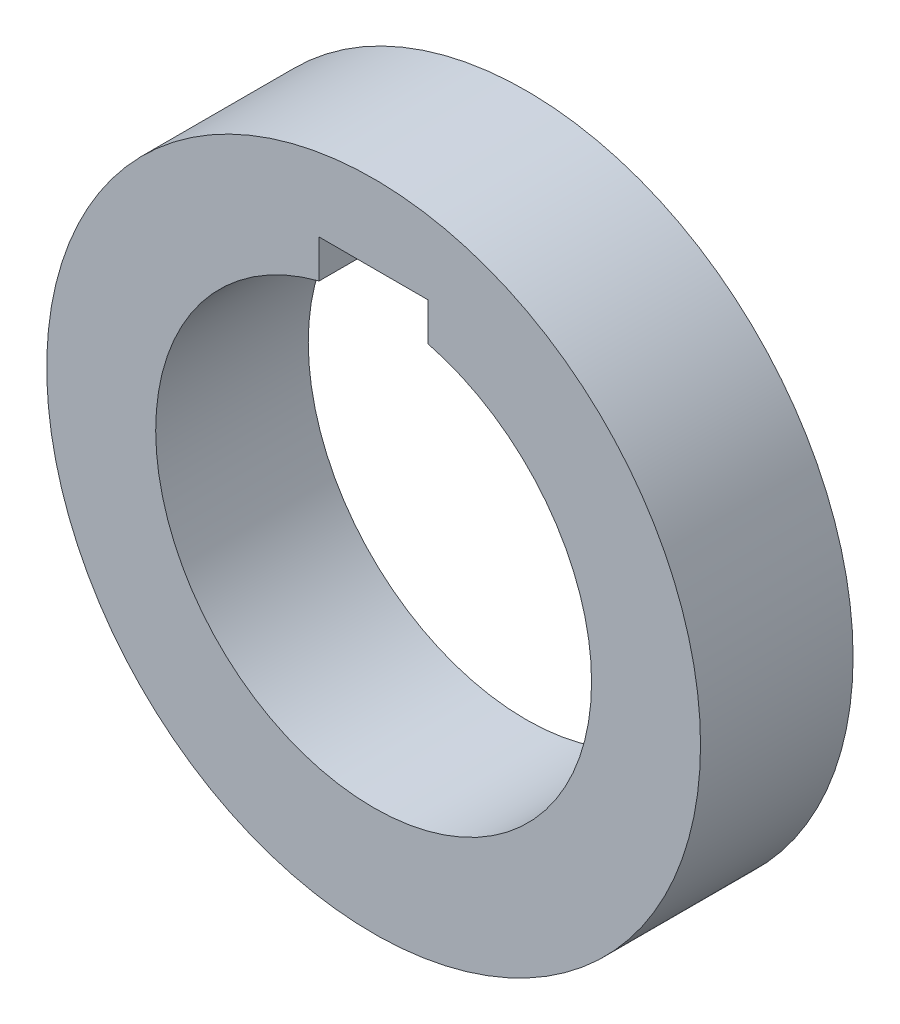
ISO-10303-21;
HEADER;
FILE_DESCRIPTION(('STEP AP214'),'2;1');
FILE_NAME('part.step','',(''),(''),'','','');
FILE_SCHEMA(('AUTOMOTIVE_DESIGN { 1 0 10303 214 1 1 1 1 }'));
ENDSEC;
DATA;
#1=APPLICATION_CONTEXT('core data for automotive mechanical design processes');
#2=APPLICATION_PROTOCOL_DEFINITION('international standard','automotive_design',2000,#1);
#3=PRODUCT_CONTEXT('',#1,'mechanical');
#4=PRODUCT('Part','Part','',(#3));
#5=PRODUCT_RELATED_PRODUCT_CATEGORY('part','',(#4));
#6=PRODUCT_DEFINITION_FORMATION('','',#4);
#7=PRODUCT_DEFINITION_CONTEXT('part definition',#1,'design');
#8=PRODUCT_DEFINITION('design','',#6,#7);
#9=PRODUCT_DEFINITION_SHAPE('','',#8);
#10=(LENGTH_UNIT() NAMED_UNIT(*) SI_UNIT(.MILLI.,.METRE.));
#11=(NAMED_UNIT(*) PLANE_ANGLE_UNIT() SI_UNIT($,.RADIAN.));
#12=(NAMED_UNIT(*) SI_UNIT($,.STERADIAN.) SOLID_ANGLE_UNIT());
#13=UNCERTAINTY_MEASURE_WITH_UNIT(LENGTH_MEASURE(1.E-05),#10,'distance_accuracy_value','');
#14=(GEOMETRIC_REPRESENTATION_CONTEXT(3) GLOBAL_UNCERTAINTY_ASSIGNED_CONTEXT((#13)) GLOBAL_UNIT_ASSIGNED_CONTEXT((#10,
#11,#12)) REPRESENTATION_CONTEXT('',''));
#15=CARTESIAN_POINT('',(0.,0.,0.));
#16=DIRECTION('',(0.,0.,1.));
#17=DIRECTION('',(1.,0.,0.));
#18=AXIS2_PLACEMENT_3D('',#15,#16,#17);
#19=CARTESIAN_POINT('',(0.,0.,7.));
#20=DIRECTION('',(0.,0.,1.));
#21=DIRECTION('',(1.,0.,0.));
#22=AXIS2_PLACEMENT_3D('',#19,#20,#21);
#23=PLANE('',#22);
#24=CARTESIAN_POINT('',(0.,0.,7.));
#25=DIRECTION('',(0.,0.,1.));
#26=DIRECTION('',(1.,0.,0.));
#27=AXIS2_PLACEMENT_3D('',#24,#25,#26);
#28=CIRCLE('',#27,15.);
#29=CARTESIAN_POINT('',(15.,0.,7.));
#30=VERTEX_POINT('',#29);
#31=EDGE_CURVE('E11',#30,#30,#28,.T.);
#32=ORIENTED_EDGE('',*,*,#31,.T.);
#33=EDGE_LOOP('',(#32));
#34=FACE_BOUND('',#33,.T.);
#35=DIRECTION('',(0.,1.,0.));
#36=VECTOR('',#35,1.);
#37=CARTESIAN_POINT('',(2.5,11.43,7.));
#38=LINE('',#37,#36);
#39=CARTESIAN_POINT('',(2.5,9.68245836551854,7.));
#40=VERTEX_POINT('',#39);
#41=CARTESIAN_POINT('',(2.5,11.43,7.));
#42=VERTEX_POINT('',#41);
#43=EDGE_CURVE('E89',#40,#42,#38,.T.);
#44=ORIENTED_EDGE('',*,*,#43,.F.);
#45=CARTESIAN_POINT('',(0.,0.,7.));
#46=DIRECTION('',(0.,0.,1.));
#47=DIRECTION('',(1.,0.,0.));
#48=AXIS2_PLACEMENT_3D('',#45,#46,#47);
#49=CIRCLE('',#48,10.);
#50=CARTESIAN_POINT('',(-2.5,9.68245836551854,7.));
#51=VERTEX_POINT('',#50);
#52=EDGE_CURVE('E85',#51,#40,#49,.T.);
#53=ORIENTED_EDGE('',*,*,#52,.F.);
#54=DIRECTION('',(0.,-1.,0.));
#55=VECTOR('',#54,1.);
#56=CARTESIAN_POINT('',(-2.5,9.68245836551854,7.));
#57=LINE('',#56,#55);
#58=CARTESIAN_POINT('',(-2.5,11.43,7.));
#59=VERTEX_POINT('',#58);
#60=EDGE_CURVE('E104',#59,#51,#57,.T.);
#61=ORIENTED_EDGE('',*,*,#60,.F.);
#62=DIRECTION('',(-1.,0.,0.));
#63=VECTOR('',#62,1.);
#64=CARTESIAN_POINT('',(-2.5,11.43,7.));
#65=LINE('',#64,#63);
#66=EDGE_CURVE('E102',#42,#59,#65,.T.);
#67=ORIENTED_EDGE('',*,*,#66,.F.);
#68=EDGE_LOOP('',(#44,#53,#61,#67));
#69=FACE_BOUND('',#68,.T.);
#70=ADVANCED_FACE('F41',(#34,#69),#23,.T.);
#71=CARTESIAN_POINT('',(0.,0.,0.));
#72=DIRECTION('',(0.,0.,1.));
#73=DIRECTION('',(1.,0.,0.));
#74=AXIS2_PLACEMENT_3D('',#71,#72,#73);
#75=PLANE('',#74);
#76=CARTESIAN_POINT('',(0.,0.,0.));
#77=DIRECTION('',(0.,0.,1.));
#78=DIRECTION('',(1.,0.,0.));
#79=AXIS2_PLACEMENT_3D('',#76,#77,#78);
#80=CIRCLE('',#79,15.);
#81=CARTESIAN_POINT('',(15.,0.,0.));
#82=VERTEX_POINT('',#81);
#83=EDGE_CURVE('E44',#82,#82,#80,.T.);
#84=ORIENTED_EDGE('',*,*,#83,.F.);
#85=EDGE_LOOP('',(#84));
#86=FACE_BOUND('',#85,.T.);
#87=CARTESIAN_POINT('',(0.,0.,0.));
#88=DIRECTION('',(0.,0.,1.));
#89=DIRECTION('',(1.,0.,0.));
#90=AXIS2_PLACEMENT_3D('',#87,#88,#89);
#91=CIRCLE('',#90,10.);
#92=CARTESIAN_POINT('',(-2.5,9.68245836551854,0.));
#93=VERTEX_POINT('',#92);
#94=CARTESIAN_POINT('',(2.5,9.68245836551854,0.));
#95=VERTEX_POINT('',#94);
#96=EDGE_CURVE('E61',#93,#95,#91,.T.);
#97=ORIENTED_EDGE('',*,*,#96,.T.);
#98=DIRECTION('',(0.,1.,0.));
#99=VECTOR('',#98,1.);
#100=CARTESIAN_POINT('',(2.5,11.43,0.));
#101=LINE('',#100,#99);
#102=CARTESIAN_POINT('',(2.5,11.43,0.));
#103=VERTEX_POINT('',#102);
#104=EDGE_CURVE('E100',#95,#103,#101,.T.);
#105=ORIENTED_EDGE('',*,*,#104,.T.);
#106=DIRECTION('',(-1.,0.,0.));
#107=VECTOR('',#106,1.);
#108=CARTESIAN_POINT('',(-2.5,11.43,0.));
#109=LINE('',#108,#107);
#110=CARTESIAN_POINT('',(-2.5,11.43,0.));
#111=VERTEX_POINT('',#110);
#112=EDGE_CURVE('E106',#103,#111,#109,.T.);
#113=ORIENTED_EDGE('',*,*,#112,.T.);
#114=DIRECTION('',(0.,-1.,0.));
#115=VECTOR('',#114,1.);
#116=CARTESIAN_POINT('',(-2.5,9.68245836551854,0.));
#117=LINE('',#116,#115);
#118=EDGE_CURVE('E91',#111,#93,#117,.T.);
#119=ORIENTED_EDGE('',*,*,#118,.T.);
#120=EDGE_LOOP('',(#97,#105,#113,#119));
#121=FACE_BOUND('',#120,.T.);
#122=ADVANCED_FACE('F118',(#86,#121),#75,.F.);
#123=CARTESIAN_POINT('',(0.,0.,7.));
#124=DIRECTION('',(0.,0.,-1.));
#125=DIRECTION('',(-1.,0.,0.));
#126=AXIS2_PLACEMENT_3D('',#123,#124,#125);
#127=CYLINDRICAL_SURFACE('',#126,15.);
#128=ORIENTED_EDGE('',*,*,#31,.F.);
#129=EDGE_LOOP('',(#128));
#130=FACE_BOUND('',#129,.T.);
#131=ORIENTED_EDGE('',*,*,#83,.T.);
#132=EDGE_LOOP('',(#131));
#133=FACE_BOUND('',#132,.T.);
#134=ADVANCED_FACE('F43',(#130,#133),#127,.T.);
#135=CARTESIAN_POINT('',(0.,0.,7.));
#136=DIRECTION('',(0.,0.,-1.));
#137=DIRECTION('',(-1.,0.,0.));
#138=AXIS2_PLACEMENT_3D('',#135,#136,#137);
#139=CYLINDRICAL_SURFACE('',#138,10.);
#140=ORIENTED_EDGE('',*,*,#96,.F.);
#141=DIRECTION('',(0.,0.,-1.));
#142=VECTOR('',#141,1.);
#143=CARTESIAN_POINT('',(-2.5,9.68245836551854,7.));
#144=LINE('',#143,#142);
#145=EDGE_CURVE('E86',#51,#93,#144,.T.);
#146=ORIENTED_EDGE('',*,*,#145,.F.);
#147=ORIENTED_EDGE('',*,*,#52,.T.);
#148=DIRECTION('',(0.,0.,-1.));
#149=VECTOR('',#148,1.);
#150=CARTESIAN_POINT('',(2.5,9.68245836551854,7.));
#151=LINE('',#150,#149);
#152=EDGE_CURVE('E82',#40,#95,#151,.T.);
#153=ORIENTED_EDGE('',*,*,#152,.T.);
#154=EDGE_LOOP('',(#140,#146,#147,#153));
#155=FACE_BOUND('',#154,.T.);
#156=ADVANCED_FACE('F84',(#155),#139,.F.);
#157=CARTESIAN_POINT('',(2.5,11.43,7.));
#158=DIRECTION('',(-1.,0.,0.));
#159=DIRECTION('',(0.,0.,1.));
#160=AXIS2_PLACEMENT_3D('',#157,#158,#159);
#161=PLANE('',#160);
#162=ORIENTED_EDGE('',*,*,#104,.F.);
#163=ORIENTED_EDGE('',*,*,#152,.F.);
#164=ORIENTED_EDGE('',*,*,#43,.T.);
#165=DIRECTION('',(0.,0.,-1.));
#166=VECTOR('',#165,1.);
#167=CARTESIAN_POINT('',(2.5,11.43,7.));
#168=LINE('',#167,#166);
#169=EDGE_CURVE('E97',#42,#103,#168,.T.);
#170=ORIENTED_EDGE('',*,*,#169,.T.);
#171=EDGE_LOOP('',(#162,#163,#164,#170));
#172=FACE_BOUND('',#171,.T.);
#173=ADVANCED_FACE('F92',(#172),#161,.T.);
#174=CARTESIAN_POINT('',(-2.5,11.43,7.));
#175=DIRECTION('',(0.,-1.,0.));
#176=DIRECTION('',(0.,0.,-1.));
#177=AXIS2_PLACEMENT_3D('',#174,#175,#176);
#178=PLANE('',#177);
#179=ORIENTED_EDGE('',*,*,#112,.F.);
#180=ORIENTED_EDGE('',*,*,#169,.F.);
#181=ORIENTED_EDGE('',*,*,#66,.T.);
#182=DIRECTION('',(0.,0.,-1.));
#183=VECTOR('',#182,1.);
#184=CARTESIAN_POINT('',(-2.5,11.43,7.));
#185=LINE('',#184,#183);
#186=EDGE_CURVE('E57',#59,#111,#185,.T.);
#187=ORIENTED_EDGE('',*,*,#186,.T.);
#188=EDGE_LOOP('',(#179,#180,#181,#187));
#189=FACE_BOUND('',#188,.T.);
#190=ADVANCED_FACE('F120',(#189),#178,.T.);
#191=CARTESIAN_POINT('',(-2.5,9.68245836551854,7.));
#192=DIRECTION('',(1.,0.,0.));
#193=DIRECTION('',(0.,0.,-1.));
#194=AXIS2_PLACEMENT_3D('',#191,#192,#193);
#195=PLANE('',#194);
#196=ORIENTED_EDGE('',*,*,#118,.F.);
#197=ORIENTED_EDGE('',*,*,#186,.F.);
#198=ORIENTED_EDGE('',*,*,#60,.T.);
#199=ORIENTED_EDGE('',*,*,#145,.T.);
#200=EDGE_LOOP('',(#196,#197,#198,#199));
#201=FACE_BOUND('',#200,.T.);
#202=ADVANCED_FACE('F123',(#201),#195,.T.);
#203=CLOSED_SHELL('',(#70,#122,#134,#156,#173,#190,#202));
#204=MANIFOLD_SOLID_BREP('B2',#203);
#205=ADVANCED_BREP_SHAPE_REPRESENTATION('',(#18,#204),#14);
#206=SHAPE_DEFINITION_REPRESENTATION(#9,#205);
ENDSEC;
END-ISO-10303-21;
